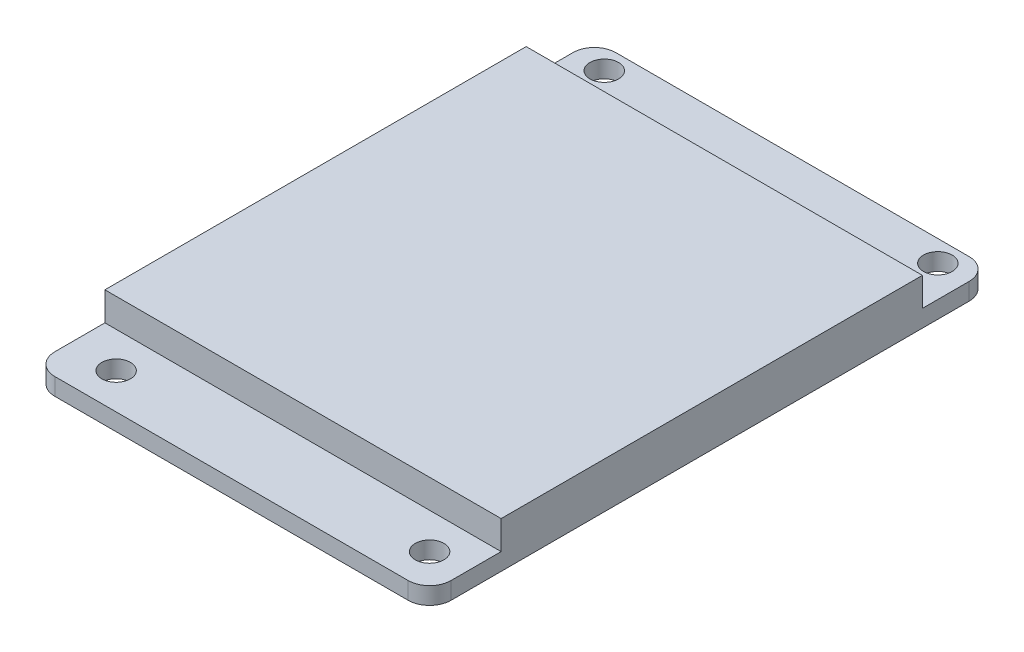
ISO-10303-21;
HEADER;
FILE_DESCRIPTION(('STEP AP214'),'2;1');
FILE_NAME('part.step','',(''),(''),'','','');
FILE_SCHEMA(('AUTOMOTIVE_DESIGN { 1 0 10303 214 1 1 1 1 }'));
ENDSEC;
DATA;
#1=APPLICATION_CONTEXT('core data for automotive mechanical design processes');
#2=APPLICATION_PROTOCOL_DEFINITION('international standard','automotive_design',2000,#1);
#3=PRODUCT_CONTEXT('',#1,'mechanical');
#4=PRODUCT('Part','Part','',(#3));
#5=PRODUCT_RELATED_PRODUCT_CATEGORY('part','',(#4));
#6=PRODUCT_DEFINITION_FORMATION('','',#4);
#7=PRODUCT_DEFINITION_CONTEXT('part definition',#1,'design');
#8=PRODUCT_DEFINITION('design','',#6,#7);
#9=PRODUCT_DEFINITION_SHAPE('','',#8);
#10=(LENGTH_UNIT() NAMED_UNIT(*) SI_UNIT(.MILLI.,.METRE.));
#11=(NAMED_UNIT(*) PLANE_ANGLE_UNIT() SI_UNIT($,.RADIAN.));
#12=(NAMED_UNIT(*) SI_UNIT($,.STERADIAN.) SOLID_ANGLE_UNIT());
#13=UNCERTAINTY_MEASURE_WITH_UNIT(LENGTH_MEASURE(1.E-05),#10,'distance_accuracy_value','');
#14=(GEOMETRIC_REPRESENTATION_CONTEXT(3) GLOBAL_UNCERTAINTY_ASSIGNED_CONTEXT((#13)) GLOBAL_UNIT_ASSIGNED_CONTEXT((#10,
#11,#12)) REPRESENTATION_CONTEXT('',''));
#15=CARTESIAN_POINT('',(0.,0.,0.));
#16=DIRECTION('',(0.,0.,1.));
#17=DIRECTION('',(1.,0.,0.));
#18=AXIS2_PLACEMENT_3D('',#15,#16,#17);
#19=CARTESIAN_POINT('',(0.,1.2,0.));
#20=DIRECTION('',(0.,1.,0.));
#21=DIRECTION('',(0.,0.,1.));
#22=AXIS2_PLACEMENT_3D('',#19,#20,#21);
#23=PLANE('',#22);
#24=DIRECTION('',(-1.,0.,0.));
#25=VECTOR('',#24,1.);
#26=CARTESIAN_POINT('',(0.,1.2,-34.4507407236188));
#27=LINE('',#26,#25);
#28=CARTESIAN_POINT('',(27.7,1.2,-34.4507407236188));
#29=VERTEX_POINT('',#28);
#30=CARTESIAN_POINT('',(0.,1.2,-34.4507407236188));
#31=VERTEX_POINT('',#30);
#32=EDGE_CURVE('E61',#29,#31,#27,.T.);
#33=ORIENTED_EDGE('',*,*,#32,.F.);
#34=DIRECTION('',(0.,0.,-1.));
#35=VECTOR('',#34,1.);
#36=CARTESIAN_POINT('',(27.7,1.2,0.));
#37=LINE('',#36,#35);
#38=CARTESIAN_POINT('',(27.7,1.2,-37.72));
#39=VERTEX_POINT('',#38);
#40=EDGE_CURVE('E189',#29,#39,#37,.T.);
#41=ORIENTED_EDGE('',*,*,#40,.T.);
#42=CARTESIAN_POINT('',(26.2,1.2,-37.72));
#43=DIRECTION('',(0.,1.,0.));
#44=DIRECTION('',(0.,0.,1.));
#45=AXIS2_PLACEMENT_3D('',#42,#43,#44);
#46=CIRCLE('',#45,1.5);
#47=CARTESIAN_POINT('',(26.2,1.2,-39.22));
#48=VERTEX_POINT('',#47);
#49=EDGE_CURVE('E193',#48,#39,#46,.F.);
#50=ORIENTED_EDGE('',*,*,#49,.F.);
#51=DIRECTION('',(1.,0.,0.));
#52=VECTOR('',#51,1.);
#53=CARTESIAN_POINT('',(0.,1.2,-39.22));
#54=LINE('',#53,#52);
#55=CARTESIAN_POINT('',(1.5,1.2,-39.22));
#56=VERTEX_POINT('',#55);
#57=EDGE_CURVE('E197',#56,#48,#54,.T.);
#58=ORIENTED_EDGE('',*,*,#57,.F.);
#59=CARTESIAN_POINT('',(1.5,1.2,-37.72));
#60=DIRECTION('',(0.,1.,0.));
#61=DIRECTION('',(0.,0.,1.));
#62=AXIS2_PLACEMENT_3D('',#59,#60,#61);
#63=CIRCLE('',#62,1.5);
#64=CARTESIAN_POINT('',(0.,1.2,-37.72));
#65=VERTEX_POINT('',#64);
#66=EDGE_CURVE('E172',#65,#56,#63,.F.);
#67=ORIENTED_EDGE('',*,*,#66,.F.);
#68=DIRECTION('',(0.,0.,-1.));
#69=VECTOR('',#68,1.);
#70=CARTESIAN_POINT('',(0.,1.2,0.));
#71=LINE('',#70,#69);
#72=EDGE_CURVE('E66',#31,#65,#71,.T.);
#73=ORIENTED_EDGE('',*,*,#72,.F.);
#74=EDGE_LOOP('',(#33,#41,#50,#58,#67,#73));
#75=FACE_BOUND('',#74,.T.);
#76=CARTESIAN_POINT('',(2.19,1.2,-37.72));
#77=DIRECTION('',(0.,1.,0.));
#78=DIRECTION('',(0.,0.,1.));
#79=AXIS2_PLACEMENT_3D('',#76,#77,#78);
#80=CIRCLE('',#79,1.);
#81=CARTESIAN_POINT('',(2.19,1.2,-36.72));
#82=VERTEX_POINT('',#81);
#83=EDGE_CURVE('E213',#82,#82,#80,.T.);
#84=ORIENTED_EDGE('',*,*,#83,.F.);
#85=EDGE_LOOP('',(#84));
#86=FACE_BOUND('',#85,.T.);
#87=CARTESIAN_POINT('',(25.51,1.2,-37.72));
#88=DIRECTION('',(0.,1.,0.));
#89=DIRECTION('',(0.,0.,1.));
#90=AXIS2_PLACEMENT_3D('',#87,#88,#89);
#91=CIRCLE('',#90,1.);
#92=CARTESIAN_POINT('',(25.51,1.2,-36.72));
#93=VERTEX_POINT('',#92);
#94=EDGE_CURVE('E209',#93,#93,#91,.T.);
#95=ORIENTED_EDGE('',*,*,#94,.F.);
#96=EDGE_LOOP('',(#95));
#97=FACE_BOUND('',#96,.T.);
#98=ADVANCED_FACE('F45',(#75,#86,#97),#23,.T.);
#99=CARTESIAN_POINT('',(1.5,1.2,-37.72));
#100=DIRECTION('',(0.,-1.,0.));
#101=DIRECTION('',(0.,0.,-1.));
#102=AXIS2_PLACEMENT_3D('',#99,#100,#101);
#103=CYLINDRICAL_SURFACE('',#102,1.5);
#104=CARTESIAN_POINT('',(1.5,0.,-37.72));
#105=DIRECTION('',(0.,1.,0.));
#106=DIRECTION('',(0.,0.,1.));
#107=AXIS2_PLACEMENT_3D('',#104,#105,#106);
#108=CIRCLE('',#107,1.5);
#109=CARTESIAN_POINT('',(0.,0.,-37.72));
#110=VERTEX_POINT('',#109);
#111=CARTESIAN_POINT('',(1.5,0.,-39.22));
#112=VERTEX_POINT('',#111);
#113=EDGE_CURVE('E161',#110,#112,#108,.F.);
#114=ORIENTED_EDGE('',*,*,#113,.F.);
#115=DIRECTION('',(0.,-1.,0.));
#116=VECTOR('',#115,1.);
#117=CARTESIAN_POINT('',(0.,1.2,-37.72));
#118=LINE('',#117,#116);
#119=EDGE_CURVE('E11',#65,#110,#118,.T.);
#120=ORIENTED_EDGE('',*,*,#119,.F.);
#121=ORIENTED_EDGE('',*,*,#66,.T.);
#122=DIRECTION('',(0.,-1.,0.));
#123=VECTOR('',#122,1.);
#124=CARTESIAN_POINT('',(1.5,1.2,-39.22));
#125=LINE('',#124,#123);
#126=EDGE_CURVE('E216',#56,#112,#125,.T.);
#127=ORIENTED_EDGE('',*,*,#126,.T.);
#128=EDGE_LOOP('',(#114,#120,#121,#127));
#129=FACE_BOUND('',#128,.T.);
#130=ADVANCED_FACE('F47',(#129),#103,.T.);
#131=CARTESIAN_POINT('',(0.,1.2,0.));
#132=DIRECTION('',(-1.,0.,0.));
#133=DIRECTION('',(0.,0.,1.));
#134=AXIS2_PLACEMENT_3D('',#131,#132,#133);
#135=PLANE('',#134);
#136=DIRECTION('',(0.,0.,-1.));
#137=VECTOR('',#136,1.);
#138=CARTESIAN_POINT('',(0.,0.,0.));
#139=LINE('',#138,#137);
#140=CARTESIAN_POINT('',(0.,0.,-1.50000000000001));
#141=VERTEX_POINT('',#140);
#142=EDGE_CURVE('E166',#141,#110,#139,.T.);
#143=ORIENTED_EDGE('',*,*,#142,.F.);
#144=DIRECTION('',(0.,-1.,0.));
#145=VECTOR('',#144,1.);
#146=CARTESIAN_POINT('',(0.,1.2,-1.50000000000001));
#147=LINE('',#146,#145);
#148=CARTESIAN_POINT('',(0.,1.2,-1.50000000000001));
#149=VERTEX_POINT('',#148);
#150=EDGE_CURVE('E54',#149,#141,#147,.T.);
#151=ORIENTED_EDGE('',*,*,#150,.F.);
#152=CARTESIAN_POINT('',(0.,1.2,-5.));
#153=VERTEX_POINT('',#152);
#154=EDGE_CURVE('E159',#149,#153,#71,.T.);
#155=ORIENTED_EDGE('',*,*,#154,.T.);
#156=DIRECTION('',(0.,-1.,0.));
#157=VECTOR('',#156,1.);
#158=CARTESIAN_POINT('',(0.,3.2,-5.));
#159=LINE('',#158,#157);
#160=CARTESIAN_POINT('',(0.,3.2,-5.));
#161=VERTEX_POINT('',#160);
#162=EDGE_CURVE('E137',#161,#153,#159,.T.);
#163=ORIENTED_EDGE('',*,*,#162,.F.);
#164=DIRECTION('',(0.,0.,1.));
#165=VECTOR('',#164,1.);
#166=CARTESIAN_POINT('',(0.,3.2,-34.4507407236188));
#167=LINE('',#166,#165);
#168=CARTESIAN_POINT('',(0.,3.2,-34.4507407236188));
#169=VERTEX_POINT('',#168);
#170=EDGE_CURVE('E144',#169,#161,#167,.T.);
#171=ORIENTED_EDGE('',*,*,#170,.F.);
#172=DIRECTION('',(0.,-1.,0.));
#173=VECTOR('',#172,1.);
#174=CARTESIAN_POINT('',(0.,3.2,-34.4507407236188));
#175=LINE('',#174,#173);
#176=EDGE_CURVE('E309',#169,#31,#175,.T.);
#177=ORIENTED_EDGE('',*,*,#176,.T.);
#178=ORIENTED_EDGE('',*,*,#72,.T.);
#179=ORIENTED_EDGE('',*,*,#119,.T.);
#180=EDGE_LOOP('',(#143,#151,#155,#163,#171,#177,#178,#179));
#181=FACE_BOUND('',#180,.T.);
#182=ADVANCED_FACE('F157',(#181),#135,.T.);
#183=CARTESIAN_POINT('',(1.5,1.2,-1.5));
#184=DIRECTION('',(0.,-1.,0.));
#185=DIRECTION('',(0.,0.,-1.));
#186=AXIS2_PLACEMENT_3D('',#183,#184,#185);
#187=CYLINDRICAL_SURFACE('',#186,1.5);
#188=CARTESIAN_POINT('',(1.5,0.,-1.5));
#189=DIRECTION('',(0.,1.,0.));
#190=DIRECTION('',(0.,0.,1.));
#191=AXIS2_PLACEMENT_3D('',#188,#189,#190);
#192=CIRCLE('',#191,1.5);
#193=CARTESIAN_POINT('',(1.50000000000001,0.,0.));
#194=VERTEX_POINT('',#193);
#195=EDGE_CURVE('E221',#194,#141,#192,.F.);
#196=ORIENTED_EDGE('',*,*,#195,.F.);
#197=DIRECTION('',(0.,-1.,0.));
#198=VECTOR('',#197,1.);
#199=CARTESIAN_POINT('',(1.50000000000001,1.2,0.));
#200=LINE('',#199,#198);
#201=CARTESIAN_POINT('',(1.50000000000001,1.2,0.));
#202=VERTEX_POINT('',#201);
#203=EDGE_CURVE('E274',#202,#194,#200,.T.);
#204=ORIENTED_EDGE('',*,*,#203,.F.);
#205=CARTESIAN_POINT('',(1.5,1.2,-1.5));
#206=DIRECTION('',(0.,1.,0.));
#207=DIRECTION('',(0.,0.,1.));
#208=AXIS2_PLACEMENT_3D('',#205,#206,#207);
#209=CIRCLE('',#208,1.5);
#210=EDGE_CURVE('E179',#202,#149,#209,.F.);
#211=ORIENTED_EDGE('',*,*,#210,.T.);
#212=ORIENTED_EDGE('',*,*,#150,.T.);
#213=EDGE_LOOP('',(#196,#204,#211,#212));
#214=FACE_BOUND('',#213,.T.);
#215=ADVANCED_FACE('F279',(#214),#187,.T.);
#216=CARTESIAN_POINT('',(0.,1.2,0.));
#217=DIRECTION('',(0.,0.,-1.));
#218=DIRECTION('',(-1.,0.,0.));
#219=AXIS2_PLACEMENT_3D('',#216,#217,#218);
#220=PLANE('',#219);
#221=DIRECTION('',(1.,0.,0.));
#222=VECTOR('',#221,1.);
#223=CARTESIAN_POINT('',(0.,0.,0.));
#224=LINE('',#223,#222);
#225=CARTESIAN_POINT('',(26.2,0.,0.));
#226=VERTEX_POINT('',#225);
#227=EDGE_CURVE('E225',#194,#226,#224,.T.);
#228=ORIENTED_EDGE('',*,*,#227,.T.);
#229=DIRECTION('',(0.,-1.,0.));
#230=VECTOR('',#229,1.);
#231=CARTESIAN_POINT('',(26.2,1.2,0.));
#232=LINE('',#231,#230);
#233=CARTESIAN_POINT('',(26.2,1.2,0.));
#234=VERTEX_POINT('',#233);
#235=EDGE_CURVE('E270',#234,#226,#232,.T.);
#236=ORIENTED_EDGE('',*,*,#235,.F.);
#237=DIRECTION('',(1.,0.,0.));
#238=VECTOR('',#237,1.);
#239=CARTESIAN_POINT('',(0.,1.2,0.));
#240=LINE('',#239,#238);
#241=EDGE_CURVE('E183',#202,#234,#240,.T.);
#242=ORIENTED_EDGE('',*,*,#241,.F.);
#243=ORIENTED_EDGE('',*,*,#203,.T.);
#244=EDGE_LOOP('',(#228,#236,#242,#243));
#245=FACE_BOUND('',#244,.T.);
#246=ADVANCED_FACE('F291',(#245),#220,.F.);
#247=CARTESIAN_POINT('',(26.2,1.2,-1.5));
#248=DIRECTION('',(0.,-1.,0.));
#249=DIRECTION('',(0.,0.,-1.));
#250=AXIS2_PLACEMENT_3D('',#247,#248,#249);
#251=CYLINDRICAL_SURFACE('',#250,1.5);
#252=CARTESIAN_POINT('',(26.2,0.,-1.5));
#253=DIRECTION('',(0.,1.,0.));
#254=DIRECTION('',(0.,0.,1.));
#255=AXIS2_PLACEMENT_3D('',#252,#253,#254);
#256=CIRCLE('',#255,1.5);
#257=CARTESIAN_POINT('',(27.7,0.,-1.5));
#258=VERTEX_POINT('',#257);
#259=EDGE_CURVE('E228',#226,#258,#256,.T.);
#260=ORIENTED_EDGE('',*,*,#259,.T.);
#261=DIRECTION('',(0.,-1.,0.));
#262=VECTOR('',#261,1.);
#263=CARTESIAN_POINT('',(27.7,1.2,-1.5));
#264=LINE('',#263,#262);
#265=CARTESIAN_POINT('',(27.7,1.2,-1.5));
#266=VERTEX_POINT('',#265);
#267=EDGE_CURVE('E266',#266,#258,#264,.T.);
#268=ORIENTED_EDGE('',*,*,#267,.F.);
#269=CARTESIAN_POINT('',(26.2,1.2,-1.5));
#270=DIRECTION('',(0.,1.,0.));
#271=DIRECTION('',(0.,0.,1.));
#272=AXIS2_PLACEMENT_3D('',#269,#270,#271);
#273=CIRCLE('',#272,1.5);
#274=EDGE_CURVE('E186',#234,#266,#273,.T.);
#275=ORIENTED_EDGE('',*,*,#274,.F.);
#276=ORIENTED_EDGE('',*,*,#235,.T.);
#277=EDGE_LOOP('',(#260,#268,#275,#276));
#278=FACE_BOUND('',#277,.T.);
#279=ADVANCED_FACE('F295',(#278),#251,.T.);
#280=CARTESIAN_POINT('',(27.7,1.2,0.));
#281=DIRECTION('',(-1.,0.,0.));
#282=DIRECTION('',(0.,0.,1.));
#283=AXIS2_PLACEMENT_3D('',#280,#281,#282);
#284=PLANE('',#283);
#285=DIRECTION('',(0.,0.,-1.));
#286=VECTOR('',#285,1.);
#287=CARTESIAN_POINT('',(27.7,0.,0.));
#288=LINE('',#287,#286);
#289=CARTESIAN_POINT('',(27.7,0.,-37.72));
#290=VERTEX_POINT('',#289);
#291=EDGE_CURVE('E231',#258,#290,#288,.T.);
#292=ORIENTED_EDGE('',*,*,#291,.T.);
#293=DIRECTION('',(0.,-1.,0.));
#294=VECTOR('',#293,1.);
#295=CARTESIAN_POINT('',(27.7,1.2,-37.72));
#296=LINE('',#295,#294);
#297=EDGE_CURVE('E263',#39,#290,#296,.T.);
#298=ORIENTED_EDGE('',*,*,#297,.F.);
#299=ORIENTED_EDGE('',*,*,#40,.F.);
#300=DIRECTION('',(0.,-1.,0.));
#301=VECTOR('',#300,1.);
#302=CARTESIAN_POINT('',(27.7,3.2,-34.4507407236188));
#303=LINE('',#302,#301);
#304=CARTESIAN_POINT('',(27.7,3.2,-34.4507407236188));
#305=VERTEX_POINT('',#304);
#306=EDGE_CURVE('E168',#305,#29,#303,.T.);
#307=ORIENTED_EDGE('',*,*,#306,.F.);
#308=DIRECTION('',(0.,0.,-1.));
#309=VECTOR('',#308,1.);
#310=CARTESIAN_POINT('',(27.7,3.2,-34.4507407236188));
#311=LINE('',#310,#309);
#312=CARTESIAN_POINT('',(27.7,3.2,-5.));
#313=VERTEX_POINT('',#312);
#314=EDGE_CURVE('E143',#313,#305,#311,.T.);
#315=ORIENTED_EDGE('',*,*,#314,.F.);
#316=DIRECTION('',(0.,-1.,0.));
#317=VECTOR('',#316,1.);
#318=CARTESIAN_POINT('',(27.7,3.2,-5.));
#319=LINE('',#318,#317);
#320=CARTESIAN_POINT('',(27.7,1.2,-5.));
#321=VERTEX_POINT('',#320);
#322=EDGE_CURVE('E139',#313,#321,#319,.T.);
#323=ORIENTED_EDGE('',*,*,#322,.T.);
#324=EDGE_CURVE('E190',#266,#321,#37,.T.);
#325=ORIENTED_EDGE('',*,*,#324,.F.);
#326=ORIENTED_EDGE('',*,*,#267,.T.);
#327=EDGE_LOOP('',(#292,#298,#299,#307,#315,#323,#325,#326));
#328=FACE_BOUND('',#327,.T.);
#329=ADVANCED_FACE('F317',(#328),#284,.F.);
#330=CARTESIAN_POINT('',(26.2,1.2,-37.72));
#331=DIRECTION('',(0.,-1.,0.));
#332=DIRECTION('',(0.,0.,-1.));
#333=AXIS2_PLACEMENT_3D('',#330,#331,#332);
#334=CYLINDRICAL_SURFACE('',#333,1.5);
#335=CARTESIAN_POINT('',(26.2,0.,-37.72));
#336=DIRECTION('',(0.,1.,0.));
#337=DIRECTION('',(0.,0.,1.));
#338=AXIS2_PLACEMENT_3D('',#335,#336,#337);
#339=CIRCLE('',#338,1.5);
#340=CARTESIAN_POINT('',(26.2,0.,-39.22));
#341=VERTEX_POINT('',#340);
#342=EDGE_CURVE('E235',#341,#290,#339,.F.);
#343=ORIENTED_EDGE('',*,*,#342,.F.);
#344=DIRECTION('',(0.,-1.,0.));
#345=VECTOR('',#344,1.);
#346=CARTESIAN_POINT('',(26.2,1.2,-39.22));
#347=LINE('',#346,#345);
#348=EDGE_CURVE('E260',#48,#341,#347,.T.);
#349=ORIENTED_EDGE('',*,*,#348,.F.);
#350=ORIENTED_EDGE('',*,*,#49,.T.);
#351=ORIENTED_EDGE('',*,*,#297,.T.);
#352=EDGE_LOOP('',(#343,#349,#350,#351));
#353=FACE_BOUND('',#352,.T.);
#354=ADVANCED_FACE('F330',(#353),#334,.T.);
#355=CARTESIAN_POINT('',(25.51,1.2,-37.72));
#356=DIRECTION('',(0.,-1.,0.));
#357=DIRECTION('',(0.,0.,-1.));
#358=AXIS2_PLACEMENT_3D('',#355,#356,#357);
#359=CYLINDRICAL_SURFACE('',#358,1.);
#360=ORIENTED_EDGE('',*,*,#94,.T.);
#361=EDGE_LOOP('',(#360));
#362=FACE_BOUND('',#361,.T.);
#363=CARTESIAN_POINT('',(25.51,0.,-37.72));
#364=DIRECTION('',(0.,1.,0.));
#365=DIRECTION('',(0.,0.,1.));
#366=AXIS2_PLACEMENT_3D('',#363,#364,#365);
#367=CIRCLE('',#366,1.);
#368=CARTESIAN_POINT('',(25.51,0.,-36.72));
#369=VERTEX_POINT('',#368);
#370=EDGE_CURVE('E251',#369,#369,#367,.T.);
#371=ORIENTED_EDGE('',*,*,#370,.F.);
#372=EDGE_LOOP('',(#371));
#373=FACE_BOUND('',#372,.T.);
#374=ADVANCED_FACE('F332',(#362,#373),#359,.F.);
#375=CARTESIAN_POINT('',(3.28607996150995,1.2,-2.5));
#376=DIRECTION('',(0.,-1.,0.));
#377=DIRECTION('',(0.,0.,-1.));
#378=AXIS2_PLACEMENT_3D('',#375,#376,#377);
#379=CYLINDRICAL_SURFACE('',#378,1.);
#380=CARTESIAN_POINT('',(3.28607996150995,1.2,-2.5));
#381=DIRECTION('',(0.,1.,0.));
#382=DIRECTION('',(0.,0.,1.));
#383=AXIS2_PLACEMENT_3D('',#380,#381,#382);
#384=CIRCLE('',#383,1.);
#385=CARTESIAN_POINT('',(3.28607996150995,1.2,-1.5));
#386=VERTEX_POINT('',#385);
#387=EDGE_CURVE('E205',#386,#386,#384,.T.);
#388=ORIENTED_EDGE('',*,*,#387,.T.);
#389=EDGE_LOOP('',(#388));
#390=FACE_BOUND('',#389,.T.);
#391=CARTESIAN_POINT('',(3.28607996150995,0.,-2.5));
#392=DIRECTION('',(0.,1.,0.));
#393=DIRECTION('',(0.,0.,1.));
#394=AXIS2_PLACEMENT_3D('',#391,#392,#393);
#395=CIRCLE('',#394,1.);
#396=CARTESIAN_POINT('',(3.28607996150995,0.,-1.5));
#397=VERTEX_POINT('',#396);
#398=EDGE_CURVE('E247',#397,#397,#395,.T.);
#399=ORIENTED_EDGE('',*,*,#398,.F.);
#400=EDGE_LOOP('',(#399));
#401=FACE_BOUND('',#400,.T.);
#402=ADVANCED_FACE('F338',(#390,#401),#379,.F.);
#403=CARTESIAN_POINT('',(25.2,1.2,-2.5));
#404=DIRECTION('',(0.,-1.,0.));
#405=DIRECTION('',(0.,0.,-1.));
#406=AXIS2_PLACEMENT_3D('',#403,#404,#405);
#407=CYLINDRICAL_SURFACE('',#406,1.);
#408=CARTESIAN_POINT('',(25.2,1.2,-2.5));
#409=DIRECTION('',(0.,1.,0.));
#410=DIRECTION('',(0.,0.,1.));
#411=AXIS2_PLACEMENT_3D('',#408,#409,#410);
#412=CIRCLE('',#411,1.);
#413=CARTESIAN_POINT('',(25.2,1.2,-1.5));
#414=VERTEX_POINT('',#413);
#415=EDGE_CURVE('E201',#414,#414,#412,.T.);
#416=ORIENTED_EDGE('',*,*,#415,.T.);
#417=EDGE_LOOP('',(#416));
#418=FACE_BOUND('',#417,.T.);
#419=CARTESIAN_POINT('',(25.2,0.,-2.5));
#420=DIRECTION('',(0.,1.,0.));
#421=DIRECTION('',(0.,0.,1.));
#422=AXIS2_PLACEMENT_3D('',#419,#420,#421);
#423=CIRCLE('',#422,1.);
#424=CARTESIAN_POINT('',(25.2,0.,-1.5));
#425=VERTEX_POINT('',#424);
#426=EDGE_CURVE('E243',#425,#425,#423,.T.);
#427=ORIENTED_EDGE('',*,*,#426,.F.);
#428=EDGE_LOOP('',(#427));
#429=FACE_BOUND('',#428,.T.);
#430=ADVANCED_FACE('F361',(#418,#429),#407,.F.);
#431=CARTESIAN_POINT('',(0.,1.2,-39.22));
#432=DIRECTION('',(0.,0.,-1.));
#433=DIRECTION('',(-1.,0.,0.));
#434=AXIS2_PLACEMENT_3D('',#431,#432,#433);
#435=PLANE('',#434);
#436=DIRECTION('',(1.,0.,0.));
#437=VECTOR('',#436,1.);
#438=CARTESIAN_POINT('',(0.,0.,-39.22));
#439=LINE('',#438,#437);
#440=EDGE_CURVE('E239',#112,#341,#439,.T.);
#441=ORIENTED_EDGE('',*,*,#440,.F.);
#442=ORIENTED_EDGE('',*,*,#126,.F.);
#443=ORIENTED_EDGE('',*,*,#57,.T.);
#444=ORIENTED_EDGE('',*,*,#348,.T.);
#445=EDGE_LOOP('',(#441,#442,#443,#444));
#446=FACE_BOUND('',#445,.T.);
#447=ADVANCED_FACE('F327',(#446),#435,.T.);
#448=CARTESIAN_POINT('',(2.19,1.2,-37.72));
#449=DIRECTION('',(0.,-1.,0.));
#450=DIRECTION('',(0.,0.,-1.));
#451=AXIS2_PLACEMENT_3D('',#448,#449,#450);
#452=CYLINDRICAL_SURFACE('',#451,1.);
#453=ORIENTED_EDGE('',*,*,#83,.T.);
#454=EDGE_LOOP('',(#453));
#455=FACE_BOUND('',#454,.T.);
#456=CARTESIAN_POINT('',(2.19,0.,-37.72));
#457=DIRECTION('',(0.,1.,0.));
#458=DIRECTION('',(0.,0.,1.));
#459=AXIS2_PLACEMENT_3D('',#456,#457,#458);
#460=CIRCLE('',#459,1.);
#461=CARTESIAN_POINT('',(2.19,0.,-36.72));
#462=VERTEX_POINT('',#461);
#463=EDGE_CURVE('E176',#462,#462,#460,.T.);
#464=ORIENTED_EDGE('',*,*,#463,.F.);
#465=EDGE_LOOP('',(#464));
#466=FACE_BOUND('',#465,.T.);
#467=ADVANCED_FACE('F351',(#455,#466),#452,.F.);
#468=DIRECTION('',(1.,0.,0.));
#469=VECTOR('',#468,1.);
#470=CARTESIAN_POINT('',(0.,1.2,-5.));
#471=LINE('',#470,#469);
#472=EDGE_CURVE('E301',#153,#321,#471,.T.);
#473=ORIENTED_EDGE('',*,*,#472,.F.);
#474=ORIENTED_EDGE('',*,*,#154,.F.);
#475=ORIENTED_EDGE('',*,*,#210,.F.);
#476=ORIENTED_EDGE('',*,*,#241,.T.);
#477=ORIENTED_EDGE('',*,*,#274,.T.);
#478=ORIENTED_EDGE('',*,*,#324,.T.);
#479=EDGE_LOOP('',(#473,#474,#475,#476,#477,#478));
#480=FACE_BOUND('',#479,.T.);
#481=ORIENTED_EDGE('',*,*,#415,.F.);
#482=EDGE_LOOP('',(#481));
#483=FACE_BOUND('',#482,.T.);
#484=ORIENTED_EDGE('',*,*,#387,.F.);
#485=EDGE_LOOP('',(#484));
#486=FACE_BOUND('',#485,.T.);
#487=ADVANCED_FACE('F299',(#480,#483,#486),#23,.T.);
#488=CARTESIAN_POINT('',(0.,0.,0.));
#489=DIRECTION('',(0.,1.,0.));
#490=DIRECTION('',(0.,0.,1.));
#491=AXIS2_PLACEMENT_3D('',#488,#489,#490);
#492=PLANE('',#491);
#493=ORIENTED_EDGE('',*,*,#113,.T.);
#494=ORIENTED_EDGE('',*,*,#440,.T.);
#495=ORIENTED_EDGE('',*,*,#342,.T.);
#496=ORIENTED_EDGE('',*,*,#291,.F.);
#497=ORIENTED_EDGE('',*,*,#259,.F.);
#498=ORIENTED_EDGE('',*,*,#227,.F.);
#499=ORIENTED_EDGE('',*,*,#195,.T.);
#500=ORIENTED_EDGE('',*,*,#142,.T.);
#501=EDGE_LOOP('',(#493,#494,#495,#496,#497,#498,#499,#500));
#502=FACE_BOUND('',#501,.T.);
#503=ORIENTED_EDGE('',*,*,#426,.T.);
#504=EDGE_LOOP('',(#503));
#505=FACE_BOUND('',#504,.T.);
#506=ORIENTED_EDGE('',*,*,#398,.T.);
#507=EDGE_LOOP('',(#506));
#508=FACE_BOUND('',#507,.T.);
#509=ORIENTED_EDGE('',*,*,#370,.T.);
#510=EDGE_LOOP('',(#509));
#511=FACE_BOUND('',#510,.T.);
#512=ORIENTED_EDGE('',*,*,#463,.T.);
#513=EDGE_LOOP('',(#512));
#514=FACE_BOUND('',#513,.T.);
#515=ADVANCED_FACE('F285',(#502,#505,#508,#511,#514),#492,.F.);
#516=CARTESIAN_POINT('',(0.,3.2,-5.));
#517=DIRECTION('',(0.,0.,-1.));
#518=DIRECTION('',(-1.,0.,0.));
#519=AXIS2_PLACEMENT_3D('',#516,#517,#518);
#520=PLANE('',#519);
#521=ORIENTED_EDGE('',*,*,#472,.T.);
#522=ORIENTED_EDGE('',*,*,#322,.F.);
#523=DIRECTION('',(1.,0.,0.));
#524=VECTOR('',#523,1.);
#525=CARTESIAN_POINT('',(0.,3.2,-5.));
#526=LINE('',#525,#524);
#527=EDGE_CURVE('E132',#161,#313,#526,.T.);
#528=ORIENTED_EDGE('',*,*,#527,.F.);
#529=ORIENTED_EDGE('',*,*,#162,.T.);
#530=EDGE_LOOP('',(#521,#522,#528,#529));
#531=FACE_BOUND('',#530,.T.);
#532=ADVANCED_FACE('F135',(#531),#520,.F.);
#533=CARTESIAN_POINT('',(0.,3.2,-34.4507407236188));
#534=DIRECTION('',(0.,0.,1.));
#535=DIRECTION('',(1.,0.,0.));
#536=AXIS2_PLACEMENT_3D('',#533,#534,#535);
#537=PLANE('',#536);
#538=ORIENTED_EDGE('',*,*,#32,.T.);
#539=ORIENTED_EDGE('',*,*,#176,.F.);
#540=DIRECTION('',(-1.,0.,0.));
#541=VECTOR('',#540,1.);
#542=CARTESIAN_POINT('',(0.,3.2,-34.4507407236188));
#543=LINE('',#542,#541);
#544=EDGE_CURVE('E149',#305,#169,#543,.T.);
#545=ORIENTED_EDGE('',*,*,#544,.F.);
#546=ORIENTED_EDGE('',*,*,#306,.T.);
#547=EDGE_LOOP('',(#538,#539,#545,#546));
#548=FACE_BOUND('',#547,.T.);
#549=ADVANCED_FACE('F315',(#548),#537,.F.);
#550=CARTESIAN_POINT('',(0.,3.2,0.));
#551=DIRECTION('',(0.,1.,0.));
#552=DIRECTION('',(0.,0.,1.));
#553=AXIS2_PLACEMENT_3D('',#550,#551,#552);
#554=PLANE('',#553);
#555=ORIENTED_EDGE('',*,*,#170,.T.);
#556=ORIENTED_EDGE('',*,*,#527,.T.);
#557=ORIENTED_EDGE('',*,*,#314,.T.);
#558=ORIENTED_EDGE('',*,*,#544,.T.);
#559=EDGE_LOOP('',(#555,#556,#557,#558));
#560=FACE_BOUND('',#559,.T.);
#561=ADVANCED_FACE('F147',(#560),#554,.T.);
#562=CLOSED_SHELL('',(#98,#130,#182,#215,#246,#279,#329,#354,#374,#402,#430,#447,#467,#487,#515,
#532,#549,#561));
#563=MANIFOLD_SOLID_BREP('B2',#562);
#564=ADVANCED_BREP_SHAPE_REPRESENTATION('',(#18,#563),#14);
#565=SHAPE_DEFINITION_REPRESENTATION(#9,#564);
ENDSEC;
END-ISO-10303-21;
